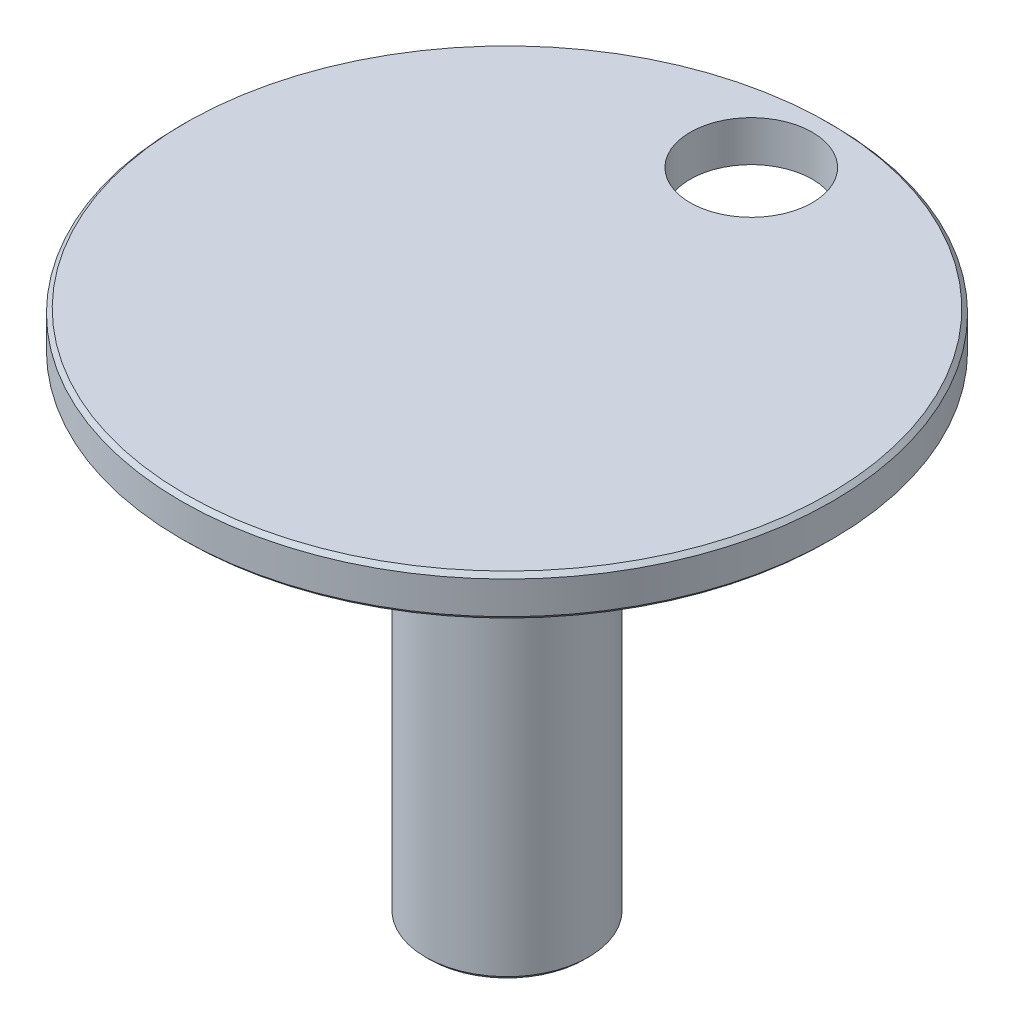
ISO-10303-21;
HEADER;
FILE_DESCRIPTION(('STEP AP214'),'2;1');
FILE_NAME('part.step','',(''),(''),'','','');
FILE_SCHEMA(('AUTOMOTIVE_DESIGN { 1 0 10303 214 1 1 1 1 }'));
ENDSEC;
DATA;
#1=APPLICATION_CONTEXT('core data for automotive mechanical design processes');
#2=APPLICATION_PROTOCOL_DEFINITION('international standard','automotive_design',2000,#1);
#3=PRODUCT_CONTEXT('',#1,'mechanical');
#4=PRODUCT('Part','Part','',(#3));
#5=PRODUCT_RELATED_PRODUCT_CATEGORY('part','',(#4));
#6=PRODUCT_DEFINITION_FORMATION('','',#4);
#7=PRODUCT_DEFINITION_CONTEXT('part definition',#1,'design');
#8=PRODUCT_DEFINITION('design','',#6,#7);
#9=PRODUCT_DEFINITION_SHAPE('','',#8);
#10=(LENGTH_UNIT() NAMED_UNIT(*) SI_UNIT(.MILLI.,.METRE.));
#11=(NAMED_UNIT(*) PLANE_ANGLE_UNIT() SI_UNIT($,.RADIAN.));
#12=(NAMED_UNIT(*) SI_UNIT($,.STERADIAN.) SOLID_ANGLE_UNIT());
#13=UNCERTAINTY_MEASURE_WITH_UNIT(LENGTH_MEASURE(1.E-05),#10,'distance_accuracy_value','');
#14=(GEOMETRIC_REPRESENTATION_CONTEXT(3) GLOBAL_UNCERTAINTY_ASSIGNED_CONTEXT((#13)) GLOBAL_UNIT_ASSIGNED_CONTEXT((#10,
#11,#12)) REPRESENTATION_CONTEXT('',''));
#15=CARTESIAN_POINT('',(0.,0.,0.));
#16=DIRECTION('',(0.,0.,1.));
#17=DIRECTION('',(1.,0.,0.));
#18=AXIS2_PLACEMENT_3D('',#15,#16,#17);
#19=CARTESIAN_POINT('',(0.,11.6,0.));
#20=DIRECTION('',(0.,-1.,0.));
#21=DIRECTION('',(0.,0.,-1.));
#22=AXIS2_PLACEMENT_3D('',#19,#20,#21);
#23=CYLINDRICAL_SURFACE('',#22,2.);
#24=CARTESIAN_POINT('',(0.,0.0999999999999925,0.));
#25=DIRECTION('',(0.,1.,0.));
#26=DIRECTION('',(0.,0.,1.));
#27=AXIS2_PLACEMENT_3D('',#24,#25,#26);
#28=CIRCLE('',#27,2.);
#29=CARTESIAN_POINT('',(0.,0.0999999999999925,2.));
#30=VERTEX_POINT('',#29);
#31=EDGE_CURVE('E62',#30,#30,#28,.T.);
#32=ORIENTED_EDGE('',*,*,#31,.T.);
#33=EDGE_LOOP('',(#32));
#34=FACE_BOUND('',#33,.T.);
#35=CARTESIAN_POINT('',(0.,11.5,0.));
#36=DIRECTION('',(0.,1.,0.));
#37=DIRECTION('',(0.,0.,1.));
#38=AXIS2_PLACEMENT_3D('',#35,#36,#37);
#39=CIRCLE('',#38,2.);
#40=CARTESIAN_POINT('',(0.,11.5,2.));
#41=VERTEX_POINT('',#40);
#42=EDGE_CURVE('E65',#41,#41,#39,.F.);
#43=ORIENTED_EDGE('',*,*,#42,.T.);
#44=EDGE_LOOP('',(#43));
#45=FACE_BOUND('',#44,.T.);
#46=ADVANCED_FACE('F35',(#34,#45),#23,.T.);
#47=CARTESIAN_POINT('',(0.,0.,0.));
#48=DIRECTION('',(0.,1.,0.));
#49=DIRECTION('',(0.,0.,1.));
#50=AXIS2_PLACEMENT_3D('',#47,#48,#49);
#51=PLANE('',#50);
#52=CARTESIAN_POINT('',(0.,0.,0.));
#53=DIRECTION('',(0.,1.,0.));
#54=DIRECTION('',(0.,0.,1.));
#55=AXIS2_PLACEMENT_3D('',#52,#53,#54);
#56=CIRCLE('',#55,1.90000000000001);
#57=CARTESIAN_POINT('',(0.,0.,1.90000000000001));
#58=VERTEX_POINT('',#57);
#59=EDGE_CURVE('E59',#58,#58,#56,.F.);
#60=ORIENTED_EDGE('',*,*,#59,.T.);
#61=EDGE_LOOP('',(#60));
#62=FACE_BOUND('',#61,.T.);
#63=CARTESIAN_POINT('',(0.,0.,0.));
#64=DIRECTION('',(0.,-1.,0.));
#65=DIRECTION('',(0.,0.,-1.));
#66=AXIS2_PLACEMENT_3D('',#63,#64,#65);
#67=CIRCLE('',#66,1.5);
#68=CARTESIAN_POINT('',(0.,0.,-1.5));
#69=VERTEX_POINT('',#68);
#70=EDGE_CURVE('E75',#69,#69,#67,.T.);
#71=ORIENTED_EDGE('',*,*,#70,.F.);
#72=EDGE_LOOP('',(#71));
#73=FACE_BOUND('',#72,.T.);
#74=ADVANCED_FACE('F108',(#62,#73),#51,.F.);
#75=CARTESIAN_POINT('',(0.,11.9,0.));
#76=DIRECTION('',(0.,-1.,0.));
#77=DIRECTION('',(0.,0.,-1.));
#78=AXIS2_PLACEMENT_3D('',#75,#76,#77);
#79=CYLINDRICAL_SURFACE('',#78,4.);
#80=CARTESIAN_POINT('',(0.,11.9,0.));
#81=DIRECTION('',(0.,1.,0.));
#82=DIRECTION('',(0.,0.,1.));
#83=AXIS2_PLACEMENT_3D('',#80,#81,#82);
#84=CIRCLE('',#83,4.);
#85=CARTESIAN_POINT('',(0.,11.9,4.));
#86=VERTEX_POINT('',#85);
#87=EDGE_CURVE('E68',#86,#86,#84,.T.);
#88=ORIENTED_EDGE('',*,*,#87,.F.);
#89=EDGE_LOOP('',(#88));
#90=FACE_BOUND('',#89,.T.);
#91=CARTESIAN_POINT('',(0.,11.6,0.));
#92=DIRECTION('',(0.,1.,0.));
#93=DIRECTION('',(0.,0.,1.));
#94=AXIS2_PLACEMENT_3D('',#91,#92,#93);
#95=CIRCLE('',#94,4.);
#96=CARTESIAN_POINT('',(0.,11.6,4.));
#97=VERTEX_POINT('',#96);
#98=EDGE_CURVE('E69',#97,#97,#95,.T.);
#99=ORIENTED_EDGE('',*,*,#98,.T.);
#100=EDGE_LOOP('',(#99));
#101=FACE_BOUND('',#100,.T.);
#102=ADVANCED_FACE('F104',(#90,#101),#79,.T.);
#103=CARTESIAN_POINT('',(0.,11.6,0.));
#104=DIRECTION('',(0.,1.,0.));
#105=DIRECTION('',(0.,0.,1.));
#106=AXIS2_PLACEMENT_3D('',#103,#104,#105);
#107=PLANE('',#106);
#108=CARTESIAN_POINT('',(0.,11.6,0.));
#109=DIRECTION('',(0.,1.,0.));
#110=DIRECTION('',(0.,0.,1.));
#111=AXIS2_PLACEMENT_3D('',#108,#109,#110);
#112=CIRCLE('',#111,2.1);
#113=CARTESIAN_POINT('',(0.,11.6,2.1));
#114=VERTEX_POINT('',#113);
#115=EDGE_CURVE('E56',#114,#114,#112,.T.);
#116=ORIENTED_EDGE('',*,*,#115,.T.);
#117=EDGE_LOOP('',(#116));
#118=FACE_BOUND('',#117,.T.);
#119=ORIENTED_EDGE('',*,*,#98,.F.);
#120=EDGE_LOOP('',(#119));
#121=FACE_BOUND('',#120,.T.);
#122=ADVANCED_FACE('F107',(#118,#121),#107,.F.);
#123=CARTESIAN_POINT('',(0.,12.9,0.));
#124=DIRECTION('',(0.,-1.,0.));
#125=DIRECTION('',(0.,0.,-1.));
#126=AXIS2_PLACEMENT_3D('',#123,#124,#125);
#127=CYLINDRICAL_SURFACE('',#126,8.);
#128=CARTESIAN_POINT('',(0.,12.,0.));
#129=DIRECTION('',(0.,1.,0.));
#130=DIRECTION('',(0.,0.,1.));
#131=AXIS2_PLACEMENT_3D('',#128,#129,#130);
#132=CIRCLE('',#131,8.);
#133=CARTESIAN_POINT('',(0.,12.,8.));
#134=VERTEX_POINT('',#133);
#135=EDGE_CURVE('E47',#134,#134,#132,.T.);
#136=ORIENTED_EDGE('',*,*,#135,.T.);
#137=EDGE_LOOP('',(#136));
#138=FACE_BOUND('',#137,.T.);
#139=CARTESIAN_POINT('',(0.,12.8,0.));
#140=DIRECTION('',(0.,1.,0.));
#141=DIRECTION('',(0.,0.,1.));
#142=AXIS2_PLACEMENT_3D('',#139,#140,#141);
#143=CIRCLE('',#142,8.);
#144=CARTESIAN_POINT('',(0.,12.8,8.));
#145=VERTEX_POINT('',#144);
#146=EDGE_CURVE('E51',#145,#145,#143,.F.);
#147=ORIENTED_EDGE('',*,*,#146,.T.);
#148=EDGE_LOOP('',(#147));
#149=FACE_BOUND('',#148,.T.);
#150=ADVANCED_FACE('F113',(#138,#149),#127,.T.);
#151=CARTESIAN_POINT('',(0.,12.9,0.));
#152=DIRECTION('',(0.,1.,0.));
#153=DIRECTION('',(0.,0.,1.));
#154=AXIS2_PLACEMENT_3D('',#151,#152,#153);
#155=PLANE('',#154);
#156=CARTESIAN_POINT('',(0.,12.9,0.));
#157=DIRECTION('',(0.,1.,0.));
#158=DIRECTION('',(0.,0.,1.));
#159=AXIS2_PLACEMENT_3D('',#156,#157,#158);
#160=CIRCLE('',#159,7.9);
#161=CARTESIAN_POINT('',(0.,12.9,7.9));
#162=VERTEX_POINT('',#161);
#163=EDGE_CURVE('E10',#162,#162,#160,.T.);
#164=ORIENTED_EDGE('',*,*,#163,.T.);
#165=EDGE_LOOP('',(#164));
#166=FACE_BOUND('',#165,.T.);
#167=CARTESIAN_POINT('',(0.,12.9,-6.));
#168=DIRECTION('',(0.,-1.,0.));
#169=DIRECTION('',(0.,0.,-1.));
#170=AXIS2_PLACEMENT_3D('',#167,#168,#169);
#171=CIRCLE('',#170,1.5);
#172=CARTESIAN_POINT('',(0.,12.9,-7.5));
#173=VERTEX_POINT('',#172);
#174=EDGE_CURVE('E78',#173,#173,#171,.T.);
#175=ORIENTED_EDGE('',*,*,#174,.T.);
#176=EDGE_LOOP('',(#175));
#177=FACE_BOUND('',#176,.T.);
#178=ADVANCED_FACE('F87',(#166,#177),#155,.T.);
#179=CARTESIAN_POINT('',(0.,11.9,0.));
#180=DIRECTION('',(0.,1.,0.));
#181=DIRECTION('',(0.,0.,1.));
#182=AXIS2_PLACEMENT_3D('',#179,#180,#181);
#183=PLANE('',#182);
#184=CARTESIAN_POINT('',(0.,11.9,0.));
#185=DIRECTION('',(0.,1.,0.));
#186=DIRECTION('',(0.,0.,1.));
#187=AXIS2_PLACEMENT_3D('',#184,#185,#186);
#188=CIRCLE('',#187,7.9);
#189=CARTESIAN_POINT('',(0.,11.9,7.9));
#190=VERTEX_POINT('',#189);
#191=EDGE_CURVE('E43',#190,#190,#188,.F.);
#192=ORIENTED_EDGE('',*,*,#191,.T.);
#193=EDGE_LOOP('',(#192));
#194=FACE_BOUND('',#193,.T.);
#195=CARTESIAN_POINT('',(0.,11.9,-6.));
#196=DIRECTION('',(0.,-1.,0.));
#197=DIRECTION('',(0.,0.,-1.));
#198=AXIS2_PLACEMENT_3D('',#195,#196,#197);
#199=CIRCLE('',#198,1.5);
#200=CARTESIAN_POINT('',(0.,11.9,-7.5));
#201=VERTEX_POINT('',#200);
#202=EDGE_CURVE('E81',#201,#201,#199,.T.);
#203=ORIENTED_EDGE('',*,*,#202,.F.);
#204=EDGE_LOOP('',(#203));
#205=FACE_BOUND('',#204,.T.);
#206=ORIENTED_EDGE('',*,*,#87,.T.);
#207=EDGE_LOOP('',(#206));
#208=FACE_BOUND('',#207,.T.);
#209=ADVANCED_FACE('F97',(#194,#205,#208),#183,.F.);
#210=CARTESIAN_POINT('',(0.,8.5,0.));
#211=DIRECTION('',(0.,-1.,0.));
#212=DIRECTION('',(0.,0.,-1.));
#213=AXIS2_PLACEMENT_3D('',#210,#211,#212);
#214=CYLINDRICAL_SURFACE('',#213,1.5);
#215=CARTESIAN_POINT('',(0.,8.5,0.));
#216=DIRECTION('',(0.,-1.,0.));
#217=DIRECTION('',(0.,0.,-1.));
#218=AXIS2_PLACEMENT_3D('',#215,#216,#217);
#219=CIRCLE('',#218,1.5);
#220=CARTESIAN_POINT('',(0.,8.5,-1.5));
#221=VERTEX_POINT('',#220);
#222=EDGE_CURVE('E72',#221,#221,#219,.T.);
#223=ORIENTED_EDGE('',*,*,#222,.F.);
#224=EDGE_LOOP('',(#223));
#225=FACE_BOUND('',#224,.T.);
#226=ORIENTED_EDGE('',*,*,#70,.T.);
#227=EDGE_LOOP('',(#226));
#228=FACE_BOUND('',#227,.T.);
#229=ADVANCED_FACE('F100',(#225,#228),#214,.F.);
#230=CARTESIAN_POINT('',(0.,8.5,0.));
#231=DIRECTION('',(0.,-1.,0.));
#232=DIRECTION('',(0.,0.,-1.));
#233=AXIS2_PLACEMENT_3D('',#230,#231,#232);
#234=PLANE('',#233);
#235=ORIENTED_EDGE('',*,*,#222,.T.);
#236=EDGE_LOOP('',(#235));
#237=FACE_BOUND('',#236,.T.);
#238=ADVANCED_FACE('F93',(#237),#234,.T.);
#239=CARTESIAN_POINT('',(0.,12.9,-6.));
#240=DIRECTION('',(0.,-1.,0.));
#241=DIRECTION('',(0.,0.,-1.));
#242=AXIS2_PLACEMENT_3D('',#239,#240,#241);
#243=CYLINDRICAL_SURFACE('',#242,1.5);
#244=ORIENTED_EDGE('',*,*,#174,.F.);
#245=EDGE_LOOP('',(#244));
#246=FACE_BOUND('',#245,.T.);
#247=ORIENTED_EDGE('',*,*,#202,.T.);
#248=EDGE_LOOP('',(#247));
#249=FACE_BOUND('',#248,.T.);
#250=ADVANCED_FACE('F89',(#246,#249),#243,.F.);
#251=CARTESIAN_POINT('',(0.,0.0999999999999925,0.));
#252=DIRECTION('',(0.,1.,0.));
#253=DIRECTION('',(0.,0.,1.));
#254=AXIS2_PLACEMENT_3D('',#251,#252,#253);
#255=CONICAL_SURFACE('',#254,2.,0.785398163397466);
#256=ORIENTED_EDGE('',*,*,#59,.F.);
#257=EDGE_LOOP('',(#256));
#258=FACE_BOUND('',#257,.T.);
#259=ORIENTED_EDGE('',*,*,#31,.F.);
#260=EDGE_LOOP('',(#259));
#261=FACE_BOUND('',#260,.T.);
#262=ADVANCED_FACE('F92',(#258,#261),#255,.T.);
#263=CARTESIAN_POINT('',(0.,11.6,0.));
#264=DIRECTION('',(0.,1.,0.));
#265=DIRECTION('',(0.,0.,1.));
#266=AXIS2_PLACEMENT_3D('',#263,#264,#265);
#267=CONICAL_SURFACE('',#266,2.1,0.785398163397448);
#268=ORIENTED_EDGE('',*,*,#42,.F.);
#269=EDGE_LOOP('',(#268));
#270=FACE_BOUND('',#269,.T.);
#271=ORIENTED_EDGE('',*,*,#115,.F.);
#272=EDGE_LOOP('',(#271));
#273=FACE_BOUND('',#272,.T.);
#274=ADVANCED_FACE('F137',(#270,#273),#267,.T.);
#275=CARTESIAN_POINT('',(0.,12.,0.));
#276=DIRECTION('',(0.,1.,0.));
#277=DIRECTION('',(0.,0.,1.));
#278=AXIS2_PLACEMENT_3D('',#275,#276,#277);
#279=CONICAL_SURFACE('',#278,8.,0.785398163397457);
#280=ORIENTED_EDGE('',*,*,#191,.F.);
#281=EDGE_LOOP('',(#280));
#282=FACE_BOUND('',#281,.T.);
#283=ORIENTED_EDGE('',*,*,#135,.F.);
#284=EDGE_LOOP('',(#283));
#285=FACE_BOUND('',#284,.T.);
#286=ADVANCED_FACE('F143',(#282,#285),#279,.T.);
#287=CARTESIAN_POINT('',(0.,12.9,0.));
#288=DIRECTION('',(0.,-1.,0.));
#289=DIRECTION('',(0.,0.,-1.));
#290=AXIS2_PLACEMENT_3D('',#287,#288,#289);
#291=CONICAL_SURFACE('',#290,7.9,0.785398163397448);
#292=ORIENTED_EDGE('',*,*,#146,.F.);
#293=EDGE_LOOP('',(#292));
#294=FACE_BOUND('',#293,.T.);
#295=ORIENTED_EDGE('',*,*,#163,.F.);
#296=EDGE_LOOP('',(#295));
#297=FACE_BOUND('',#296,.T.);
#298=ADVANCED_FACE('F38',(#294,#297),#291,.T.);
#299=CLOSED_SHELL('',(#46,#74,#102,#122,#150,#178,#209,#229,#238,#250,#262,#274,#286,#298));
#300=MANIFOLD_SOLID_BREP('B2',#299);
#301=ADVANCED_BREP_SHAPE_REPRESENTATION('',(#18,#300),#14);
#302=SHAPE_DEFINITION_REPRESENTATION(#9,#301);
ENDSEC;
END-ISO-10303-21;
